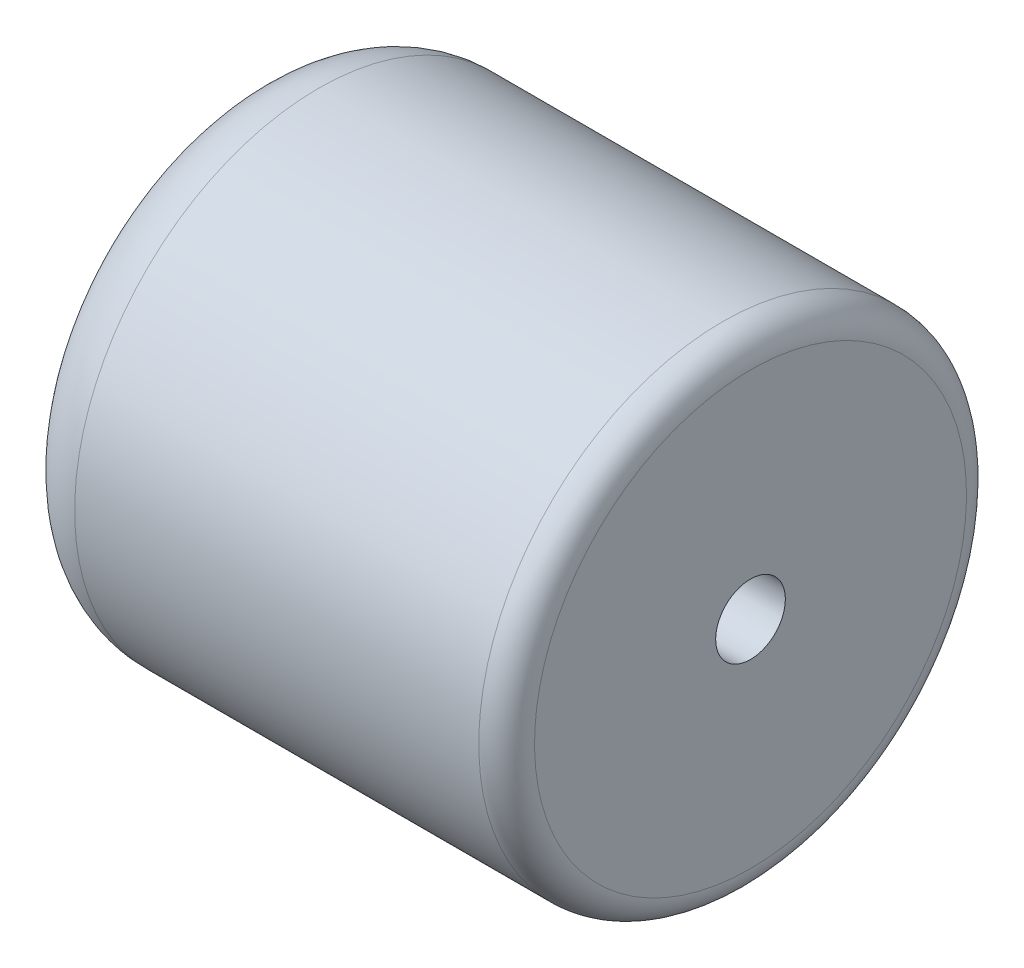
ISO-10303-21;
HEADER;
FILE_DESCRIPTION(('STEP AP214'),'2;1');
FILE_NAME('part.step','',(''),(''),'','','');
FILE_SCHEMA(('AUTOMOTIVE_DESIGN { 1 0 10303 214 1 1 1 1 }'));
ENDSEC;
DATA;
#1=APPLICATION_CONTEXT('core data for automotive mechanical design processes');
#2=APPLICATION_PROTOCOL_DEFINITION('international standard','automotive_design',2000,#1);
#3=PRODUCT_CONTEXT('',#1,'mechanical');
#4=PRODUCT('Part','Part','',(#3));
#5=PRODUCT_RELATED_PRODUCT_CATEGORY('part','',(#4));
#6=PRODUCT_DEFINITION_FORMATION('','',#4);
#7=PRODUCT_DEFINITION_CONTEXT('part definition',#1,'design');
#8=PRODUCT_DEFINITION('design','',#6,#7);
#9=PRODUCT_DEFINITION_SHAPE('','',#8);
#10=(LENGTH_UNIT() NAMED_UNIT(*) SI_UNIT(.MILLI.,.METRE.));
#11=(NAMED_UNIT(*) PLANE_ANGLE_UNIT() SI_UNIT($,.RADIAN.));
#12=(NAMED_UNIT(*) SI_UNIT($,.STERADIAN.) SOLID_ANGLE_UNIT());
#13=UNCERTAINTY_MEASURE_WITH_UNIT(LENGTH_MEASURE(1.E-05),#10,'distance_accuracy_value','');
#14=(GEOMETRIC_REPRESENTATION_CONTEXT(3) GLOBAL_UNCERTAINTY_ASSIGNED_CONTEXT((#13)) GLOBAL_UNIT_ASSIGNED_CONTEXT((#10,
#11,#12)) REPRESENTATION_CONTEXT('',''));
#15=CARTESIAN_POINT('',(0.,0.,0.));
#16=DIRECTION('',(0.,0.,1.));
#17=DIRECTION('',(1.,0.,0.));
#18=AXIS2_PLACEMENT_3D('',#15,#16,#17);
#19=CARTESIAN_POINT('',(26.,0.,0.));
#20=DIRECTION('',(-1.,0.,0.));
#21=DIRECTION('',(0.,-1.,0.));
#22=AXIS2_PLACEMENT_3D('',#19,#20,#21);
#23=PLANE('',#22);
#24=CARTESIAN_POINT('',(26.,0.,0.));
#25=DIRECTION('',(-1.,0.,0.));
#26=DIRECTION('',(0.,-1.,0.));
#27=AXIS2_PLACEMENT_3D('',#24,#25,#26);
#28=CIRCLE('',#27,2.5);
#29=CARTESIAN_POINT('',(26.,-2.5,0.));
#30=VERTEX_POINT('',#29);
#31=EDGE_CURVE('E53',#30,#30,#28,.T.);
#32=ORIENTED_EDGE('',*,*,#31,.F.);
#33=EDGE_LOOP('',(#32));
#34=FACE_BOUND('',#33,.T.);
#35=ADVANCED_FACE('F38',(#34),#23,.F.);
#36=CARTESIAN_POINT('',(0.,0.,0.));
#37=DIRECTION('',(-1.,0.,0.));
#38=DIRECTION('',(0.,-1.,0.));
#39=AXIS2_PLACEMENT_3D('',#36,#37,#38);
#40=CYLINDRICAL_SURFACE('',#39,2.5);
#41=ORIENTED_EDGE('',*,*,#31,.T.);
#42=EDGE_LOOP('',(#41));
#43=FACE_BOUND('',#42,.T.);
#44=CARTESIAN_POINT('',(36.,0.,0.));
#45=DIRECTION('',(-1.,0.,0.));
#46=DIRECTION('',(0.,-1.,0.));
#47=AXIS2_PLACEMENT_3D('',#44,#45,#46);
#48=CIRCLE('',#47,2.5);
#49=CARTESIAN_POINT('',(36.,-2.5,0.));
#50=VERTEX_POINT('',#49);
#51=EDGE_CURVE('E49',#50,#50,#48,.T.);
#52=ORIENTED_EDGE('',*,*,#51,.F.);
#53=EDGE_LOOP('',(#52));
#54=FACE_BOUND('',#53,.T.);
#55=ADVANCED_FACE('F69',(#43,#54),#40,.F.);
#56=CARTESIAN_POINT('',(36.,0.,0.));
#57=DIRECTION('',(-1.,0.,0.));
#58=DIRECTION('',(0.,-1.,0.));
#59=AXIS2_PLACEMENT_3D('',#56,#57,#58);
#60=PLANE('',#59);
#61=CARTESIAN_POINT('',(36.,0.,0.));
#62=DIRECTION('',(-1.,0.,0.));
#63=DIRECTION('',(0.,-1.,0.));
#64=AXIS2_PLACEMENT_3D('',#61,#62,#63);
#65=CIRCLE('',#64,15.5);
#66=CARTESIAN_POINT('',(36.,-15.5,0.));
#67=VERTEX_POINT('',#66);
#68=EDGE_CURVE('E45',#67,#67,#65,.T.);
#69=ORIENTED_EDGE('',*,*,#68,.F.);
#70=EDGE_LOOP('',(#69));
#71=FACE_BOUND('',#70,.T.);
#72=ORIENTED_EDGE('',*,*,#51,.T.);
#73=EDGE_LOOP('',(#72));
#74=FACE_BOUND('',#73,.T.);
#75=ADVANCED_FACE('F76',(#71,#74),#60,.F.);
#76=CARTESIAN_POINT('',(34.,0.,0.));
#77=DIRECTION('',(-1.,0.,0.));
#78=DIRECTION('',(0.,-1.,0.));
#79=AXIS2_PLACEMENT_3D('',#76,#77,#78);
#80=TOROIDAL_SURFACE('',#79,15.5,2.);
#81=ORIENTED_EDGE('',*,*,#68,.T.);
#82=EDGE_LOOP('',(#81));
#83=FACE_BOUND('',#82,.T.);
#84=CARTESIAN_POINT('',(34.,0.,0.));
#85=DIRECTION('',(-1.,0.,0.));
#86=DIRECTION('',(0.,-1.,0.));
#87=AXIS2_PLACEMENT_3D('',#84,#85,#86);
#88=CIRCLE('',#87,17.5);
#89=CARTESIAN_POINT('',(34.,-17.5,0.));
#90=VERTEX_POINT('',#89);
#91=EDGE_CURVE('E10',#90,#90,#88,.T.);
#92=ORIENTED_EDGE('',*,*,#91,.F.);
#93=EDGE_LOOP('',(#92));
#94=FACE_BOUND('',#93,.T.);
#95=ADVANCED_FACE('F80',(#83,#94),#80,.T.);
#96=CARTESIAN_POINT('',(5.,0.,0.));
#97=DIRECTION('',(-1.,0.,0.));
#98=DIRECTION('',(0.,-1.,0.));
#99=AXIS2_PLACEMENT_3D('',#96,#97,#98);
#100=TOROIDAL_SURFACE('',#99,12.5,5.);
#101=CARTESIAN_POINT('',(0.,0.,0.));
#102=DIRECTION('',(-1.,0.,0.));
#103=DIRECTION('',(0.,-1.,0.));
#104=AXIS2_PLACEMENT_3D('',#101,#102,#103);
#105=CIRCLE('',#104,12.5);
#106=CARTESIAN_POINT('',(0.,-12.5,0.));
#107=VERTEX_POINT('',#106);
#108=EDGE_CURVE('E58',#107,#107,#105,.T.);
#109=ORIENTED_EDGE('',*,*,#108,.F.);
#110=EDGE_LOOP('',(#109));
#111=FACE_BOUND('',#110,.T.);
#112=CARTESIAN_POINT('',(5.00000000000004,0.,0.));
#113=DIRECTION('',(-1.,0.,0.));
#114=DIRECTION('',(0.,-1.,0.));
#115=AXIS2_PLACEMENT_3D('',#112,#113,#114);
#116=CIRCLE('',#115,17.5);
#117=CARTESIAN_POINT('',(5.00000000000004,-17.5,0.));
#118=VERTEX_POINT('',#117);
#119=EDGE_CURVE('E61',#118,#118,#116,.T.);
#120=ORIENTED_EDGE('',*,*,#119,.T.);
#121=EDGE_LOOP('',(#120));
#122=FACE_BOUND('',#121,.T.);
#123=ADVANCED_FACE('F65',(#111,#122),#100,.T.);
#124=CARTESIAN_POINT('',(0.,0.,0.));
#125=DIRECTION('',(-1.,0.,0.));
#126=DIRECTION('',(0.,-1.,0.));
#127=AXIS2_PLACEMENT_3D('',#124,#125,#126);
#128=PLANE('',#127);
#129=ORIENTED_EDGE('',*,*,#108,.T.);
#130=EDGE_LOOP('',(#129));
#131=FACE_BOUND('',#130,.T.);
#132=ADVANCED_FACE('F68',(#131),#128,.T.);
#133=CARTESIAN_POINT('',(0.,0.,0.));
#134=DIRECTION('',(-1.,0.,0.));
#135=DIRECTION('',(0.,-1.,0.));
#136=AXIS2_PLACEMENT_3D('',#133,#134,#135);
#137=CYLINDRICAL_SURFACE('',#136,17.5);
#138=ORIENTED_EDGE('',*,*,#91,.T.);
#139=EDGE_LOOP('',(#138));
#140=FACE_BOUND('',#139,.T.);
#141=ORIENTED_EDGE('',*,*,#119,.F.);
#142=EDGE_LOOP('',(#141));
#143=FACE_BOUND('',#142,.T.);
#144=ADVANCED_FACE('F40',(#140,#143),#137,.T.);
#145=CLOSED_SHELL('',(#35,#55,#75,#95,#123,#132,#144));
#146=MANIFOLD_SOLID_BREP('B2',#145);
#147=ADVANCED_BREP_SHAPE_REPRESENTATION('',(#18,#146),#14);
#148=SHAPE_DEFINITION_REPRESENTATION(#9,#147);
ENDSEC;
END-ISO-10303-21;
